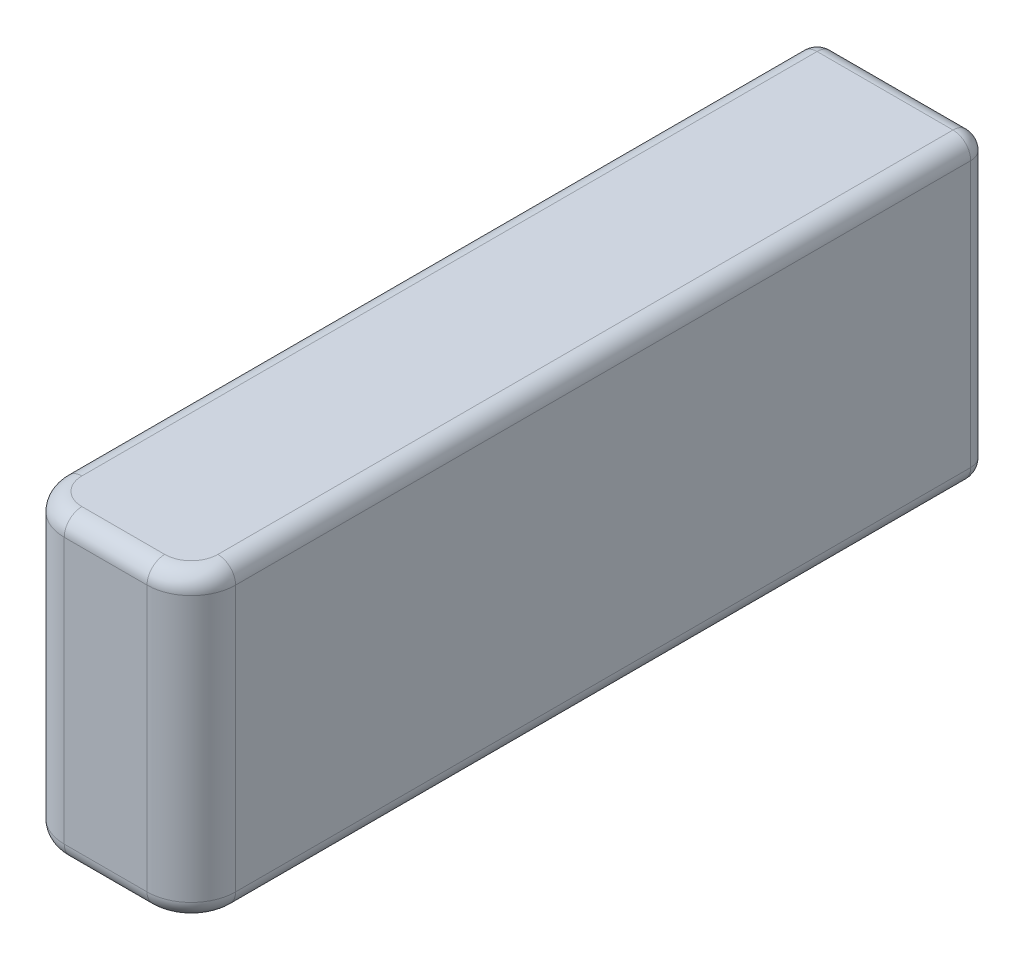
ISO-10303-21;
HEADER;
FILE_DESCRIPTION(('STEP AP214'),'2;1');
FILE_NAME('part.step','',(''),(''),'','','');
FILE_SCHEMA(('AUTOMOTIVE_DESIGN { 1 0 10303 214 1 1 1 1 }'));
ENDSEC;
DATA;
#1=APPLICATION_CONTEXT('core data for automotive mechanical design processes');
#2=APPLICATION_PROTOCOL_DEFINITION('international standard','automotive_design',2000,#1);
#3=PRODUCT_CONTEXT('',#1,'mechanical');
#4=PRODUCT('Part','Part','',(#3));
#5=PRODUCT_RELATED_PRODUCT_CATEGORY('part','',(#4));
#6=PRODUCT_DEFINITION_FORMATION('','',#4);
#7=PRODUCT_DEFINITION_CONTEXT('part definition',#1,'design');
#8=PRODUCT_DEFINITION('design','',#6,#7);
#9=PRODUCT_DEFINITION_SHAPE('','',#8);
#10=(LENGTH_UNIT() NAMED_UNIT(*) SI_UNIT(.MILLI.,.METRE.));
#11=(NAMED_UNIT(*) PLANE_ANGLE_UNIT() SI_UNIT($,.RADIAN.));
#12=(NAMED_UNIT(*) SI_UNIT($,.STERADIAN.) SOLID_ANGLE_UNIT());
#13=UNCERTAINTY_MEASURE_WITH_UNIT(LENGTH_MEASURE(1.E-05),#10,'distance_accuracy_value','');
#14=(GEOMETRIC_REPRESENTATION_CONTEXT(3) GLOBAL_UNCERTAINTY_ASSIGNED_CONTEXT((#13)) GLOBAL_UNIT_ASSIGNED_CONTEXT((#10,
#11,#12)) REPRESENTATION_CONTEXT('',''));
#15=CARTESIAN_POINT('',(0.,0.,0.));
#16=DIRECTION('',(0.,0.,1.));
#17=DIRECTION('',(1.,0.,0.));
#18=AXIS2_PLACEMENT_3D('',#15,#16,#17);
#19=CARTESIAN_POINT('',(0.,34.,90.));
#20=DIRECTION('',(0.,-1.,0.));
#21=DIRECTION('',(0.,0.,-1.));
#22=AXIS2_PLACEMENT_3D('',#19,#20,#21);
#23=PLANE('',#22);
#24=CARTESIAN_POINT('',(4.99999999999999,34.,85.));
#25=DIRECTION('',(0.,-1.,0.));
#26=DIRECTION('',(0.,0.,-1.));
#27=AXIS2_PLACEMENT_3D('',#24,#25,#26);
#28=CIRCLE('',#27,3.);
#29=CARTESIAN_POINT('',(4.99999999999999,34.,88.));
#30=VERTEX_POINT('',#29);
#31=CARTESIAN_POINT('',(1.99999999999999,34.,85.));
#32=VERTEX_POINT('',#31);
#33=EDGE_CURVE('E252',#30,#32,#28,.T.);
#34=ORIENTED_EDGE('',*,*,#33,.F.);
#35=DIRECTION('',(-1.,0.,0.));
#36=VECTOR('',#35,1.);
#37=CARTESIAN_POINT('',(0.,34.,88.));
#38=LINE('',#37,#36);
#39=CARTESIAN_POINT('',(14.35,34.,88.));
#40=VERTEX_POINT('',#39);
#41=EDGE_CURVE('E181',#30,#40,#38,.F.);
#42=ORIENTED_EDGE('',*,*,#41,.T.);
#43=CARTESIAN_POINT('',(14.35,34.,85.));
#44=DIRECTION('',(0.,-1.,0.));
#45=DIRECTION('',(0.,0.,-1.));
#46=AXIS2_PLACEMENT_3D('',#43,#44,#45);
#47=CIRCLE('',#46,3.);
#48=CARTESIAN_POINT('',(17.35,34.,85.));
#49=VERTEX_POINT('',#48);
#50=EDGE_CURVE('E249',#49,#40,#47,.T.);
#51=ORIENTED_EDGE('',*,*,#50,.F.);
#52=DIRECTION('',(0.,0.,-1.));
#53=VECTOR('',#52,1.);
#54=CARTESIAN_POINT('',(17.35,34.,90.));
#55=LINE('',#54,#53);
#56=CARTESIAN_POINT('',(17.35,34.,2.));
#57=VERTEX_POINT('',#56);
#58=EDGE_CURVE('E145',#49,#57,#55,.T.);
#59=ORIENTED_EDGE('',*,*,#58,.T.);
#60=DIRECTION('',(-1.,0.,0.));
#61=VECTOR('',#60,1.);
#62=CARTESIAN_POINT('',(0.,34.,2.));
#63=LINE('',#62,#61);
#64=CARTESIAN_POINT('',(1.99999999999999,34.,2.));
#65=VERTEX_POINT('',#64);
#66=EDGE_CURVE('E139',#57,#65,#63,.T.);
#67=ORIENTED_EDGE('',*,*,#66,.T.);
#68=DIRECTION('',(0.,0.,-1.));
#69=VECTOR('',#68,1.);
#70=CARTESIAN_POINT('',(1.99999999999999,34.,90.));
#71=LINE('',#70,#69);
#72=EDGE_CURVE('E142',#65,#32,#71,.F.);
#73=ORIENTED_EDGE('',*,*,#72,.T.);
#74=EDGE_LOOP('',(#34,#42,#51,#59,#67,#73));
#75=FACE_BOUND('',#74,.T.);
#76=ADVANCED_FACE('F34',(#75),#23,.F.);
#77=CARTESIAN_POINT('',(0.,0.,90.));
#78=DIRECTION('',(0.,1.,0.));
#79=DIRECTION('',(0.,0.,1.));
#80=AXIS2_PLACEMENT_3D('',#77,#78,#79);
#81=PLANE('',#80);
#82=CARTESIAN_POINT('',(5.,0.,85.));
#83=DIRECTION('',(0.,1.,0.));
#84=DIRECTION('',(0.,0.,1.));
#85=AXIS2_PLACEMENT_3D('',#82,#83,#84);
#86=CIRCLE('',#85,3.);
#87=CARTESIAN_POINT('',(2.,0.,85.));
#88=VERTEX_POINT('',#87);
#89=CARTESIAN_POINT('',(5.,0.,88.));
#90=VERTEX_POINT('',#89);
#91=EDGE_CURVE('E246',#88,#90,#86,.T.);
#92=ORIENTED_EDGE('',*,*,#91,.F.);
#93=DIRECTION('',(0.,0.,-1.));
#94=VECTOR('',#93,1.);
#95=CARTESIAN_POINT('',(2.,0.,90.));
#96=LINE('',#95,#94);
#97=CARTESIAN_POINT('',(2.,0.,2.));
#98=VERTEX_POINT('',#97);
#99=EDGE_CURVE('E186',#88,#98,#96,.T.);
#100=ORIENTED_EDGE('',*,*,#99,.T.);
#101=DIRECTION('',(1.,0.,0.));
#102=VECTOR('',#101,1.);
#103=CARTESIAN_POINT('',(19.35,0.,2.));
#104=LINE('',#103,#102);
#105=CARTESIAN_POINT('',(17.35,0.,2.));
#106=VERTEX_POINT('',#105);
#107=EDGE_CURVE('E184',#98,#106,#104,.T.);
#108=ORIENTED_EDGE('',*,*,#107,.T.);
#109=DIRECTION('',(0.,0.,-1.));
#110=VECTOR('',#109,1.);
#111=CARTESIAN_POINT('',(17.35,0.,90.));
#112=LINE('',#111,#110);
#113=CARTESIAN_POINT('',(17.35,0.,85.));
#114=VERTEX_POINT('',#113);
#115=EDGE_CURVE('E188',#106,#114,#112,.F.);
#116=ORIENTED_EDGE('',*,*,#115,.T.);
#117=CARTESIAN_POINT('',(14.35,0.,85.));
#118=DIRECTION('',(0.,1.,0.));
#119=DIRECTION('',(0.,0.,1.));
#120=AXIS2_PLACEMENT_3D('',#117,#118,#119);
#121=CIRCLE('',#120,3.);
#122=CARTESIAN_POINT('',(14.35,0.,88.));
#123=VERTEX_POINT('',#122);
#124=EDGE_CURVE('E243',#123,#114,#121,.T.);
#125=ORIENTED_EDGE('',*,*,#124,.F.);
#126=DIRECTION('',(1.,0.,0.));
#127=VECTOR('',#126,1.);
#128=CARTESIAN_POINT('',(0.,0.,88.));
#129=LINE('',#128,#127);
#130=EDGE_CURVE('E191',#123,#90,#129,.F.);
#131=ORIENTED_EDGE('',*,*,#130,.T.);
#132=EDGE_LOOP('',(#92,#100,#108,#116,#125,#131));
#133=FACE_BOUND('',#132,.T.);
#134=ADVANCED_FACE('F292',(#133),#81,.F.);
#135=CARTESIAN_POINT('',(0.,0.,90.));
#136=DIRECTION('',(1.,0.,0.));
#137=DIRECTION('',(0.,1.,0.));
#138=AXIS2_PLACEMENT_3D('',#135,#136,#137);
#139=PLANE('',#138);
#140=DIRECTION('',(0.,0.,-1.));
#141=VECTOR('',#140,1.);
#142=CARTESIAN_POINT('',(0.,2.,90.));
#143=LINE('',#142,#141);
#144=CARTESIAN_POINT('',(0.,2.,2.));
#145=VERTEX_POINT('',#144);
#146=CARTESIAN_POINT('',(0.,2.,85.));
#147=VERTEX_POINT('',#146);
#148=EDGE_CURVE('E209',#145,#147,#143,.F.);
#149=ORIENTED_EDGE('',*,*,#148,.T.);
#150=DIRECTION('',(0.,-1.,0.));
#151=VECTOR('',#150,1.);
#152=CARTESIAN_POINT('',(0.,0.,85.));
#153=LINE('',#152,#151);
#154=CARTESIAN_POINT('',(0.,32.,85.));
#155=VERTEX_POINT('',#154);
#156=EDGE_CURVE('E11',#147,#155,#153,.F.);
#157=ORIENTED_EDGE('',*,*,#156,.T.);
#158=DIRECTION('',(0.,0.,-1.));
#159=VECTOR('',#158,1.);
#160=CARTESIAN_POINT('',(0.,32.,90.));
#161=LINE('',#160,#159);
#162=CARTESIAN_POINT('',(0.,32.,2.));
#163=VERTEX_POINT('',#162);
#164=EDGE_CURVE('E211',#155,#163,#161,.T.);
#165=ORIENTED_EDGE('',*,*,#164,.T.);
#166=DIRECTION('',(0.,-1.,0.));
#167=VECTOR('',#166,1.);
#168=CARTESIAN_POINT('',(0.,0.,2.));
#169=LINE('',#168,#167);
#170=EDGE_CURVE('E207',#163,#145,#169,.T.);
#171=ORIENTED_EDGE('',*,*,#170,.T.);
#172=EDGE_LOOP('',(#149,#157,#165,#171));
#173=FACE_BOUND('',#172,.T.);
#174=ADVANCED_FACE('F337',(#173),#139,.F.);
#175=CARTESIAN_POINT('',(19.35,0.,90.));
#176=DIRECTION('',(-1.,0.,0.));
#177=DIRECTION('',(0.,-1.,0.));
#178=AXIS2_PLACEMENT_3D('',#175,#176,#177);
#179=PLANE('',#178);
#180=DIRECTION('',(0.,0.,-1.));
#181=VECTOR('',#180,1.);
#182=CARTESIAN_POINT('',(19.35,32.,90.));
#183=LINE('',#182,#181);
#184=CARTESIAN_POINT('',(19.35,32.,2.));
#185=VERTEX_POINT('',#184);
#186=CARTESIAN_POINT('',(19.35,32.,85.));
#187=VERTEX_POINT('',#186);
#188=EDGE_CURVE('E198',#185,#187,#183,.F.);
#189=ORIENTED_EDGE('',*,*,#188,.T.);
#190=DIRECTION('',(0.,1.,0.));
#191=VECTOR('',#190,1.);
#192=CARTESIAN_POINT('',(19.35,0.,85.));
#193=LINE('',#192,#191);
#194=CARTESIAN_POINT('',(19.35,2.,85.));
#195=VERTEX_POINT('',#194);
#196=EDGE_CURVE('E43',#187,#195,#193,.F.);
#197=ORIENTED_EDGE('',*,*,#196,.T.);
#198=DIRECTION('',(0.,0.,-1.));
#199=VECTOR('',#198,1.);
#200=CARTESIAN_POINT('',(19.35,2.,90.));
#201=LINE('',#200,#199);
#202=CARTESIAN_POINT('',(19.35,2.,2.));
#203=VERTEX_POINT('',#202);
#204=EDGE_CURVE('E196',#195,#203,#201,.T.);
#205=ORIENTED_EDGE('',*,*,#204,.T.);
#206=DIRECTION('',(0.,1.,0.));
#207=VECTOR('',#206,1.);
#208=CARTESIAN_POINT('',(19.35,34.,2.));
#209=LINE('',#208,#207);
#210=EDGE_CURVE('E194',#203,#185,#209,.T.);
#211=ORIENTED_EDGE('',*,*,#210,.T.);
#212=EDGE_LOOP('',(#189,#197,#205,#211));
#213=FACE_BOUND('',#212,.T.);
#214=ADVANCED_FACE('F320',(#213),#179,.F.);
#215=CARTESIAN_POINT('',(0.,0.,90.));
#216=DIRECTION('',(0.,0.,-1.));
#217=DIRECTION('',(-1.,0.,0.));
#218=AXIS2_PLACEMENT_3D('',#215,#216,#217);
#219=PLANE('',#218);
#220=DIRECTION('',(1.,0.,0.));
#221=VECTOR('',#220,1.);
#222=CARTESIAN_POINT('',(0.,2.,90.));
#223=LINE('',#222,#221);
#224=CARTESIAN_POINT('',(4.99999999999999,2.,90.));
#225=VERTEX_POINT('',#224);
#226=CARTESIAN_POINT('',(14.35,2.,90.));
#227=VERTEX_POINT('',#226);
#228=EDGE_CURVE('E176',#225,#227,#223,.T.);
#229=ORIENTED_EDGE('',*,*,#228,.T.);
#230=DIRECTION('',(0.,1.,0.));
#231=VECTOR('',#230,1.);
#232=CARTESIAN_POINT('',(14.35,0.,90.));
#233=LINE('',#232,#231);
#234=CARTESIAN_POINT('',(14.35,32.,90.));
#235=VERTEX_POINT('',#234);
#236=EDGE_CURVE('E264',#227,#235,#233,.T.);
#237=ORIENTED_EDGE('',*,*,#236,.T.);
#238=DIRECTION('',(-1.,0.,0.));
#239=VECTOR('',#238,1.);
#240=CARTESIAN_POINT('',(0.,32.,90.));
#241=LINE('',#240,#239);
#242=CARTESIAN_POINT('',(4.99999999999999,32.,90.));
#243=VERTEX_POINT('',#242);
#244=EDGE_CURVE('E173',#235,#243,#241,.T.);
#245=ORIENTED_EDGE('',*,*,#244,.T.);
#246=DIRECTION('',(0.,-1.,0.));
#247=VECTOR('',#246,1.);
#248=CARTESIAN_POINT('',(5.,0.,90.));
#249=LINE('',#248,#247);
#250=EDGE_CURVE('E262',#243,#225,#249,.T.);
#251=ORIENTED_EDGE('',*,*,#250,.T.);
#252=EDGE_LOOP('',(#229,#237,#245,#251));
#253=FACE_BOUND('',#252,.T.);
#254=ADVANCED_FACE('F343',(#253),#219,.F.);
#255=CARTESIAN_POINT('',(0.,0.,0.));
#256=DIRECTION('',(0.,0.,-1.));
#257=DIRECTION('',(-1.,0.,0.));
#258=AXIS2_PLACEMENT_3D('',#255,#256,#257);
#259=PLANE('',#258);
#260=DIRECTION('',(-1.,0.,0.));
#261=VECTOR('',#260,1.);
#262=CARTESIAN_POINT('',(19.35,32.,0.));
#263=LINE('',#262,#261);
#264=CARTESIAN_POINT('',(1.99999999999999,32.,0.));
#265=VERTEX_POINT('',#264);
#266=CARTESIAN_POINT('',(17.35,32.,0.));
#267=VERTEX_POINT('',#266);
#268=EDGE_CURVE('E156',#265,#267,#263,.F.);
#269=ORIENTED_EDGE('',*,*,#268,.T.);
#270=DIRECTION('',(0.,1.,0.));
#271=VECTOR('',#270,1.);
#272=CARTESIAN_POINT('',(17.35,0.,0.));
#273=LINE('',#272,#271);
#274=CARTESIAN_POINT('',(17.35,2.,0.));
#275=VERTEX_POINT('',#274);
#276=EDGE_CURVE('E205',#267,#275,#273,.F.);
#277=ORIENTED_EDGE('',*,*,#276,.T.);
#278=DIRECTION('',(1.,0.,0.));
#279=VECTOR('',#278,1.);
#280=CARTESIAN_POINT('',(0.,2.,0.));
#281=LINE('',#280,#279);
#282=CARTESIAN_POINT('',(2.,2.,0.));
#283=VERTEX_POINT('',#282);
#284=EDGE_CURVE('E202',#275,#283,#281,.F.);
#285=ORIENTED_EDGE('',*,*,#284,.T.);
#286=DIRECTION('',(0.,-1.,0.));
#287=VECTOR('',#286,1.);
#288=CARTESIAN_POINT('',(1.99999999999999,34.,0.));
#289=LINE('',#288,#287);
#290=EDGE_CURVE('E200',#283,#265,#289,.F.);
#291=ORIENTED_EDGE('',*,*,#290,.T.);
#292=EDGE_LOOP('',(#269,#277,#285,#291));
#293=FACE_BOUND('',#292,.T.);
#294=ADVANCED_FACE('F309',(#293),#259,.T.);
#295=CARTESIAN_POINT('',(0.,2.,88.));
#296=DIRECTION('',(1.,0.,0.));
#297=DIRECTION('',(0.,0.,-1.));
#298=AXIS2_PLACEMENT_3D('',#295,#296,#297);
#299=CYLINDRICAL_SURFACE('',#298,2.);
#300=ORIENTED_EDGE('',*,*,#228,.F.);
#301=CARTESIAN_POINT('',(5.,2.,88.));
#302=DIRECTION('',(1.,0.,0.));
#303=DIRECTION('',(0.,0.,-1.));
#304=AXIS2_PLACEMENT_3D('',#301,#302,#303);
#305=CIRCLE('',#304,2.);
#306=EDGE_CURVE('E240',#225,#90,#305,.T.);
#307=ORIENTED_EDGE('',*,*,#306,.T.);
#308=ORIENTED_EDGE('',*,*,#130,.F.);
#309=CARTESIAN_POINT('',(14.35,2.,88.));
#310=DIRECTION('',(-1.,0.,0.));
#311=DIRECTION('',(0.,0.,1.));
#312=AXIS2_PLACEMENT_3D('',#309,#310,#311);
#313=CIRCLE('',#312,2.);
#314=EDGE_CURVE('E212',#123,#227,#313,.T.);
#315=ORIENTED_EDGE('',*,*,#314,.T.);
#316=EDGE_LOOP('',(#300,#307,#308,#315));
#317=FACE_BOUND('',#316,.T.);
#318=ADVANCED_FACE('F508',(#317),#299,.T.);
#319=CARTESIAN_POINT('',(17.35,2.,90.));
#320=DIRECTION('',(0.,0.,-1.));
#321=DIRECTION('',(-1.,0.,0.));
#322=AXIS2_PLACEMENT_3D('',#319,#320,#321);
#323=CYLINDRICAL_SURFACE('',#322,2.);
#324=ORIENTED_EDGE('',*,*,#204,.F.);
#325=CARTESIAN_POINT('',(17.35,2.,85.));
#326=DIRECTION('',(0.,0.,-1.));
#327=DIRECTION('',(-1.,0.,0.));
#328=AXIS2_PLACEMENT_3D('',#325,#326,#327);
#329=CIRCLE('',#328,2.);
#330=EDGE_CURVE('E258',#195,#114,#329,.T.);
#331=ORIENTED_EDGE('',*,*,#330,.T.);
#332=ORIENTED_EDGE('',*,*,#115,.F.);
#333=CARTESIAN_POINT('',(17.35,2.,2.));
#334=DIRECTION('',(0.,0.,-1.));
#335=DIRECTION('',(-1.,0.,0.));
#336=AXIS2_PLACEMENT_3D('',#333,#334,#335);
#337=CIRCLE('',#336,2.);
#338=EDGE_CURVE('E233',#203,#106,#337,.T.);
#339=ORIENTED_EDGE('',*,*,#338,.F.);
#340=EDGE_LOOP('',(#324,#331,#332,#339));
#341=FACE_BOUND('',#340,.T.);
#342=ADVANCED_FACE('F288',(#341),#323,.T.);
#343=CARTESIAN_POINT('',(2.,2.,90.));
#344=DIRECTION('',(0.,0.,-1.));
#345=DIRECTION('',(-1.,0.,0.));
#346=AXIS2_PLACEMENT_3D('',#343,#344,#345);
#347=CYLINDRICAL_SURFACE('',#346,2.);
#348=ORIENTED_EDGE('',*,*,#99,.F.);
#349=CARTESIAN_POINT('',(2.,2.,85.));
#350=DIRECTION('',(0.,0.,-1.));
#351=DIRECTION('',(-1.,0.,0.));
#352=AXIS2_PLACEMENT_3D('',#349,#350,#351);
#353=CIRCLE('',#352,2.);
#354=EDGE_CURVE('E51',#88,#147,#353,.T.);
#355=ORIENTED_EDGE('',*,*,#354,.T.);
#356=ORIENTED_EDGE('',*,*,#148,.F.);
#357=CARTESIAN_POINT('',(2.,2.,2.));
#358=DIRECTION('',(0.,0.,-1.));
#359=DIRECTION('',(-1.,0.,0.));
#360=AXIS2_PLACEMENT_3D('',#357,#358,#359);
#361=CIRCLE('',#360,2.);
#362=EDGE_CURVE('E230',#98,#145,#361,.T.);
#363=ORIENTED_EDGE('',*,*,#362,.F.);
#364=EDGE_LOOP('',(#348,#355,#356,#363));
#365=FACE_BOUND('',#364,.T.);
#366=ADVANCED_FACE('F301',(#365),#347,.T.);
#367=CARTESIAN_POINT('',(0.,2.,2.));
#368=DIRECTION('',(-1.,0.,0.));
#369=DIRECTION('',(0.,0.,1.));
#370=AXIS2_PLACEMENT_3D('',#367,#368,#369);
#371=CYLINDRICAL_SURFACE('',#370,2.);
#372=CARTESIAN_POINT('',(17.35,2.,2.));
#373=DIRECTION('',(1.,0.,0.));
#374=DIRECTION('',(0.,0.,-1.));
#375=AXIS2_PLACEMENT_3D('',#372,#373,#374);
#376=CIRCLE('',#375,2.);
#377=EDGE_CURVE('E236',#106,#275,#376,.T.);
#378=ORIENTED_EDGE('',*,*,#377,.F.);
#379=ORIENTED_EDGE('',*,*,#107,.F.);
#380=CARTESIAN_POINT('',(2.,2.,2.));
#381=DIRECTION('',(-1.,0.,0.));
#382=DIRECTION('',(0.,-1.,0.));
#383=AXIS2_PLACEMENT_3D('',#380,#381,#382);
#384=CIRCLE('',#383,2.);
#385=EDGE_CURVE('E227',#283,#98,#384,.T.);
#386=ORIENTED_EDGE('',*,*,#385,.F.);
#387=ORIENTED_EDGE('',*,*,#284,.F.);
#388=EDGE_LOOP('',(#378,#379,#386,#387));
#389=FACE_BOUND('',#388,.T.);
#390=ADVANCED_FACE('F298',(#389),#371,.T.);
#391=CARTESIAN_POINT('',(17.35,2.,2.));
#392=DIRECTION('',(0.,0.,1.));
#393=DIRECTION('',(1.,0.,0.));
#394=AXIS2_PLACEMENT_3D('',#391,#392,#393);
#395=SPHERICAL_SURFACE('',#394,2.);
#396=ORIENTED_EDGE('',*,*,#338,.T.);
#397=ORIENTED_EDGE('',*,*,#377,.T.);
#398=CARTESIAN_POINT('',(17.35,2.,2.));
#399=DIRECTION('',(0.,-1.,0.));
#400=DIRECTION('',(1.,0.,0.));
#401=AXIS2_PLACEMENT_3D('',#398,#399,#400);
#402=CIRCLE('',#401,2.);
#403=EDGE_CURVE('E224',#203,#275,#402,.F.);
#404=ORIENTED_EDGE('',*,*,#403,.F.);
#405=EDGE_LOOP('',(#396,#397,#404));
#406=FACE_BOUND('',#405,.T.);
#407=ADVANCED_FACE('F313',(#406),#395,.T.);
#408=CARTESIAN_POINT('',(2.,2.,2.));
#409=DIRECTION('',(0.,0.,1.));
#410=DIRECTION('',(1.,0.,0.));
#411=AXIS2_PLACEMENT_3D('',#408,#409,#410);
#412=SPHERICAL_SURFACE('',#411,2.);
#413=ORIENTED_EDGE('',*,*,#385,.T.);
#414=ORIENTED_EDGE('',*,*,#362,.T.);
#415=CARTESIAN_POINT('',(2.,2.,2.));
#416=DIRECTION('',(0.,-1.,0.));
#417=DIRECTION('',(1.,0.,0.));
#418=AXIS2_PLACEMENT_3D('',#415,#416,#417);
#419=CIRCLE('',#418,2.);
#420=EDGE_CURVE('E221',#283,#145,#419,.F.);
#421=ORIENTED_EDGE('',*,*,#420,.F.);
#422=EDGE_LOOP('',(#413,#414,#421));
#423=FACE_BOUND('',#422,.T.);
#424=ADVANCED_FACE('F303',(#423),#412,.T.);
#425=CARTESIAN_POINT('',(17.35,0.,2.));
#426=DIRECTION('',(0.,-1.,0.));
#427=DIRECTION('',(1.,0.,0.));
#428=AXIS2_PLACEMENT_3D('',#425,#426,#427);
#429=CYLINDRICAL_SURFACE('',#428,2.);
#430=ORIENTED_EDGE('',*,*,#403,.T.);
#431=ORIENTED_EDGE('',*,*,#276,.F.);
#432=CARTESIAN_POINT('',(17.35,32.,2.));
#433=DIRECTION('',(0.,1.,0.));
#434=DIRECTION('',(0.,0.,1.));
#435=AXIS2_PLACEMENT_3D('',#432,#433,#434);
#436=CIRCLE('',#435,2.);
#437=EDGE_CURVE('E217',#185,#267,#436,.T.);
#438=ORIENTED_EDGE('',*,*,#437,.F.);
#439=ORIENTED_EDGE('',*,*,#210,.F.);
#440=EDGE_LOOP('',(#430,#431,#438,#439));
#441=FACE_BOUND('',#440,.T.);
#442=ADVANCED_FACE('F316',(#441),#429,.T.);
#443=CARTESIAN_POINT('',(2.,0.,2.));
#444=DIRECTION('',(0.,1.,0.));
#445=DIRECTION('',(-1.,0.,0.));
#446=AXIS2_PLACEMENT_3D('',#443,#444,#445);
#447=CYLINDRICAL_SURFACE('',#446,2.);
#448=ORIENTED_EDGE('',*,*,#420,.T.);
#449=ORIENTED_EDGE('',*,*,#170,.F.);
#450=CARTESIAN_POINT('',(1.99999999999999,32.,2.));
#451=DIRECTION('',(0.,1.,0.));
#452=DIRECTION('',(-1.,0.,0.));
#453=AXIS2_PLACEMENT_3D('',#450,#451,#452);
#454=CIRCLE('',#453,2.);
#455=EDGE_CURVE('E160',#265,#163,#454,.T.);
#456=ORIENTED_EDGE('',*,*,#455,.F.);
#457=ORIENTED_EDGE('',*,*,#290,.F.);
#458=EDGE_LOOP('',(#448,#449,#456,#457));
#459=FACE_BOUND('',#458,.T.);
#460=ADVANCED_FACE('F307',(#459),#447,.T.);
#461=CARTESIAN_POINT('',(0.,32.,2.));
#462=DIRECTION('',(1.,0.,0.));
#463=DIRECTION('',(0.,0.,-1.));
#464=AXIS2_PLACEMENT_3D('',#461,#462,#463);
#465=CYLINDRICAL_SURFACE('',#464,2.);
#466=CARTESIAN_POINT('',(17.35,32.,2.));
#467=DIRECTION('',(1.,0.,0.));
#468=DIRECTION('',(0.,0.,-1.));
#469=AXIS2_PLACEMENT_3D('',#466,#467,#468);
#470=CIRCLE('',#469,2.);
#471=EDGE_CURVE('E219',#267,#57,#470,.T.);
#472=ORIENTED_EDGE('',*,*,#471,.F.);
#473=ORIENTED_EDGE('',*,*,#268,.F.);
#474=CARTESIAN_POINT('',(1.99999999999999,32.,2.));
#475=DIRECTION('',(-1.,0.,0.));
#476=DIRECTION('',(0.,0.,1.));
#477=AXIS2_PLACEMENT_3D('',#474,#475,#476);
#478=CIRCLE('',#477,2.);
#479=EDGE_CURVE('E152',#65,#265,#478,.T.);
#480=ORIENTED_EDGE('',*,*,#479,.F.);
#481=ORIENTED_EDGE('',*,*,#66,.F.);
#482=EDGE_LOOP('',(#472,#473,#480,#481));
#483=FACE_BOUND('',#482,.T.);
#484=ADVANCED_FACE('F154',(#483),#465,.T.);
#485=CARTESIAN_POINT('',(17.35,32.,2.));
#486=DIRECTION('',(0.,0.,1.));
#487=DIRECTION('',(1.,0.,0.));
#488=AXIS2_PLACEMENT_3D('',#485,#486,#487);
#489=SPHERICAL_SURFACE('',#488,2.);
#490=ORIENTED_EDGE('',*,*,#437,.T.);
#491=ORIENTED_EDGE('',*,*,#471,.T.);
#492=CARTESIAN_POINT('',(17.35,32.,2.));
#493=DIRECTION('',(0.,0.,-1.));
#494=DIRECTION('',(-1.,0.,0.));
#495=AXIS2_PLACEMENT_3D('',#492,#493,#494);
#496=CIRCLE('',#495,2.);
#497=EDGE_CURVE('E161',#185,#57,#496,.F.);
#498=ORIENTED_EDGE('',*,*,#497,.F.);
#499=EDGE_LOOP('',(#490,#491,#498));
#500=FACE_BOUND('',#499,.T.);
#501=ADVANCED_FACE('F323',(#500),#489,.T.);
#502=CARTESIAN_POINT('',(1.99999999999999,32.,2.));
#503=DIRECTION('',(0.,0.,1.));
#504=DIRECTION('',(1.,0.,0.));
#505=AXIS2_PLACEMENT_3D('',#502,#503,#504);
#506=SPHERICAL_SURFACE('',#505,2.);
#507=ORIENTED_EDGE('',*,*,#479,.T.);
#508=ORIENTED_EDGE('',*,*,#455,.T.);
#509=CARTESIAN_POINT('',(1.99999999999999,32.,2.));
#510=DIRECTION('',(0.,0.,-1.));
#511=DIRECTION('',(-1.,0.,0.));
#512=AXIS2_PLACEMENT_3D('',#509,#510,#511);
#513=CIRCLE('',#512,2.);
#514=EDGE_CURVE('E164',#65,#163,#513,.F.);
#515=ORIENTED_EDGE('',*,*,#514,.F.);
#516=EDGE_LOOP('',(#507,#508,#515));
#517=FACE_BOUND('',#516,.T.);
#518=ADVANCED_FACE('F165',(#517),#506,.T.);
#519=CARTESIAN_POINT('',(17.35,32.,90.));
#520=DIRECTION('',(0.,0.,-1.));
#521=DIRECTION('',(-1.,0.,0.));
#522=AXIS2_PLACEMENT_3D('',#519,#520,#521);
#523=CYLINDRICAL_SURFACE('',#522,2.);
#524=ORIENTED_EDGE('',*,*,#58,.F.);
#525=CARTESIAN_POINT('',(17.35,32.,85.));
#526=DIRECTION('',(0.,0.,-1.));
#527=DIRECTION('',(-1.,0.,0.));
#528=AXIS2_PLACEMENT_3D('',#525,#526,#527);
#529=CIRCLE('',#528,2.);
#530=EDGE_CURVE('E59',#49,#187,#529,.T.);
#531=ORIENTED_EDGE('',*,*,#530,.T.);
#532=ORIENTED_EDGE('',*,*,#188,.F.);
#533=ORIENTED_EDGE('',*,*,#497,.T.);
#534=EDGE_LOOP('',(#524,#531,#532,#533));
#535=FACE_BOUND('',#534,.T.);
#536=ADVANCED_FACE('F321',(#535),#523,.T.);
#537=CARTESIAN_POINT('',(1.99999999999999,32.,90.));
#538=DIRECTION('',(0.,0.,-1.));
#539=DIRECTION('',(-1.,0.,0.));
#540=AXIS2_PLACEMENT_3D('',#537,#538,#539);
#541=CYLINDRICAL_SURFACE('',#540,2.);
#542=ORIENTED_EDGE('',*,*,#164,.F.);
#543=CARTESIAN_POINT('',(1.99999999999999,32.,85.));
#544=DIRECTION('',(0.,0.,-1.));
#545=DIRECTION('',(-1.,0.,0.));
#546=AXIS2_PLACEMENT_3D('',#543,#544,#545);
#547=CIRCLE('',#546,2.);
#548=EDGE_CURVE('E172',#155,#32,#547,.T.);
#549=ORIENTED_EDGE('',*,*,#548,.T.);
#550=ORIENTED_EDGE('',*,*,#72,.F.);
#551=ORIENTED_EDGE('',*,*,#514,.T.);
#552=EDGE_LOOP('',(#542,#549,#550,#551));
#553=FACE_BOUND('',#552,.T.);
#554=ADVANCED_FACE('F170',(#553),#541,.T.);
#555=CARTESIAN_POINT('',(0.,32.,88.));
#556=DIRECTION('',(-1.,0.,0.));
#557=DIRECTION('',(0.,0.,1.));
#558=AXIS2_PLACEMENT_3D('',#555,#556,#557);
#559=CYLINDRICAL_SURFACE('',#558,2.);
#560=ORIENTED_EDGE('',*,*,#244,.F.);
#561=CARTESIAN_POINT('',(14.35,32.,88.));
#562=DIRECTION('',(-1.,0.,0.));
#563=DIRECTION('',(0.,0.,1.));
#564=AXIS2_PLACEMENT_3D('',#561,#562,#563);
#565=CIRCLE('',#564,2.);
#566=EDGE_CURVE('E256',#235,#40,#565,.T.);
#567=ORIENTED_EDGE('',*,*,#566,.T.);
#568=ORIENTED_EDGE('',*,*,#41,.F.);
#569=CARTESIAN_POINT('',(4.99999999999999,32.,88.));
#570=DIRECTION('',(1.,0.,0.));
#571=DIRECTION('',(0.,0.,-1.));
#572=AXIS2_PLACEMENT_3D('',#569,#570,#571);
#573=CIRCLE('',#572,2.);
#574=EDGE_CURVE('E254',#30,#243,#573,.T.);
#575=ORIENTED_EDGE('',*,*,#574,.T.);
#576=EDGE_LOOP('',(#560,#567,#568,#575));
#577=FACE_BOUND('',#576,.T.);
#578=ADVANCED_FACE('F348',(#577),#559,.T.);
#579=CARTESIAN_POINT('',(4.99999999999999,32.,85.));
#580=DIRECTION('',(0.,-1.,0.));
#581=DIRECTION('',(0.,0.,-1.));
#582=AXIS2_PLACEMENT_3D('',#579,#580,#581);
#583=TOROIDAL_SURFACE('',#582,3.,2.);
#584=ORIENTED_EDGE('',*,*,#33,.T.);
#585=ORIENTED_EDGE('',*,*,#548,.F.);
#586=CARTESIAN_POINT('',(4.99999999999999,32.,85.));
#587=DIRECTION('',(0.,-1.,0.));
#588=DIRECTION('',(0.,0.,-1.));
#589=AXIS2_PLACEMENT_3D('',#586,#587,#588);
#590=CIRCLE('',#589,5.);
#591=EDGE_CURVE('E168',#243,#155,#590,.T.);
#592=ORIENTED_EDGE('',*,*,#591,.F.);
#593=ORIENTED_EDGE('',*,*,#574,.F.);
#594=EDGE_LOOP('',(#584,#585,#592,#593));
#595=FACE_BOUND('',#594,.T.);
#596=ADVANCED_FACE('F351',(#595),#583,.T.);
#597=CARTESIAN_POINT('',(5.,0.,85.));
#598=DIRECTION('',(0.,-1.,0.));
#599=DIRECTION('',(1.,0.,0.));
#600=AXIS2_PLACEMENT_3D('',#597,#598,#599);
#601=CYLINDRICAL_SURFACE('',#600,5.);
#602=ORIENTED_EDGE('',*,*,#591,.T.);
#603=ORIENTED_EDGE('',*,*,#156,.F.);
#604=CARTESIAN_POINT('',(5.,2.,85.));
#605=DIRECTION('',(0.,1.,0.));
#606=DIRECTION('',(0.,0.,1.));
#607=AXIS2_PLACEMENT_3D('',#604,#605,#606);
#608=CIRCLE('',#607,5.);
#609=EDGE_CURVE('E267',#225,#147,#608,.F.);
#610=ORIENTED_EDGE('',*,*,#609,.F.);
#611=ORIENTED_EDGE('',*,*,#250,.F.);
#612=EDGE_LOOP('',(#602,#603,#610,#611));
#613=FACE_BOUND('',#612,.T.);
#614=ADVANCED_FACE('F375',(#613),#601,.T.);
#615=CARTESIAN_POINT('',(5.,2.,85.));
#616=DIRECTION('',(0.,1.,0.));
#617=DIRECTION('',(0.,0.,1.));
#618=AXIS2_PLACEMENT_3D('',#615,#616,#617);
#619=TOROIDAL_SURFACE('',#618,3.,2.);
#620=ORIENTED_EDGE('',*,*,#306,.F.);
#621=ORIENTED_EDGE('',*,*,#609,.T.);
#622=ORIENTED_EDGE('',*,*,#354,.F.);
#623=ORIENTED_EDGE('',*,*,#91,.T.);
#624=EDGE_LOOP('',(#620,#621,#622,#623));
#625=FACE_BOUND('',#624,.T.);
#626=ADVANCED_FACE('F383',(#625),#619,.T.);
#627=CARTESIAN_POINT('',(14.35,2.,85.));
#628=DIRECTION('',(0.,1.,0.));
#629=DIRECTION('',(0.,0.,1.));
#630=AXIS2_PLACEMENT_3D('',#627,#628,#629);
#631=TOROIDAL_SURFACE('',#630,3.,2.);
#632=ORIENTED_EDGE('',*,*,#124,.T.);
#633=ORIENTED_EDGE('',*,*,#330,.F.);
#634=CARTESIAN_POINT('',(14.35,2.,85.));
#635=DIRECTION('',(0.,1.,0.));
#636=DIRECTION('',(0.,0.,1.));
#637=AXIS2_PLACEMENT_3D('',#634,#635,#636);
#638=CIRCLE('',#637,5.);
#639=EDGE_CURVE('E38',#227,#195,#638,.T.);
#640=ORIENTED_EDGE('',*,*,#639,.F.);
#641=ORIENTED_EDGE('',*,*,#314,.F.);
#642=EDGE_LOOP('',(#632,#633,#640,#641));
#643=FACE_BOUND('',#642,.T.);
#644=ADVANCED_FACE('F36',(#643),#631,.T.);
#645=CARTESIAN_POINT('',(14.35,0.,85.));
#646=DIRECTION('',(0.,1.,0.));
#647=DIRECTION('',(-1.,0.,0.));
#648=AXIS2_PLACEMENT_3D('',#645,#646,#647);
#649=CYLINDRICAL_SURFACE('',#648,5.);
#650=ORIENTED_EDGE('',*,*,#639,.T.);
#651=ORIENTED_EDGE('',*,*,#196,.F.);
#652=CARTESIAN_POINT('',(14.35,32.,85.));
#653=DIRECTION('',(0.,-1.,0.));
#654=DIRECTION('',(0.,0.,-1.));
#655=AXIS2_PLACEMENT_3D('',#652,#653,#654);
#656=CIRCLE('',#655,5.);
#657=EDGE_CURVE('E271',#235,#187,#656,.F.);
#658=ORIENTED_EDGE('',*,*,#657,.F.);
#659=ORIENTED_EDGE('',*,*,#236,.F.);
#660=EDGE_LOOP('',(#650,#651,#658,#659));
#661=FACE_BOUND('',#660,.T.);
#662=ADVANCED_FACE('F281',(#661),#649,.T.);
#663=CARTESIAN_POINT('',(14.35,32.,85.));
#664=DIRECTION('',(0.,-1.,0.));
#665=DIRECTION('',(0.,0.,-1.));
#666=AXIS2_PLACEMENT_3D('',#663,#664,#665);
#667=TOROIDAL_SURFACE('',#666,3.,2.);
#668=ORIENTED_EDGE('',*,*,#530,.F.);
#669=ORIENTED_EDGE('',*,*,#50,.T.);
#670=ORIENTED_EDGE('',*,*,#566,.F.);
#671=ORIENTED_EDGE('',*,*,#657,.T.);
#672=EDGE_LOOP('',(#668,#669,#670,#671));
#673=FACE_BOUND('',#672,.T.);
#674=ADVANCED_FACE('F403',(#673),#667,.T.);
#675=CLOSED_SHELL('',(#76,#134,#174,#214,#254,#294,#318,#342,#366,#390,#407,#424,#442,#460,#484,
#501,#518,#536,#554,#578,#596,#614,#626,#644,#662,#674));
#676=MANIFOLD_SOLID_BREP('B2',#675);
#677=ADVANCED_BREP_SHAPE_REPRESENTATION('',(#18,#676),#14);
#678=SHAPE_DEFINITION_REPRESENTATION(#9,#677);
ENDSEC;
END-ISO-10303-21;
